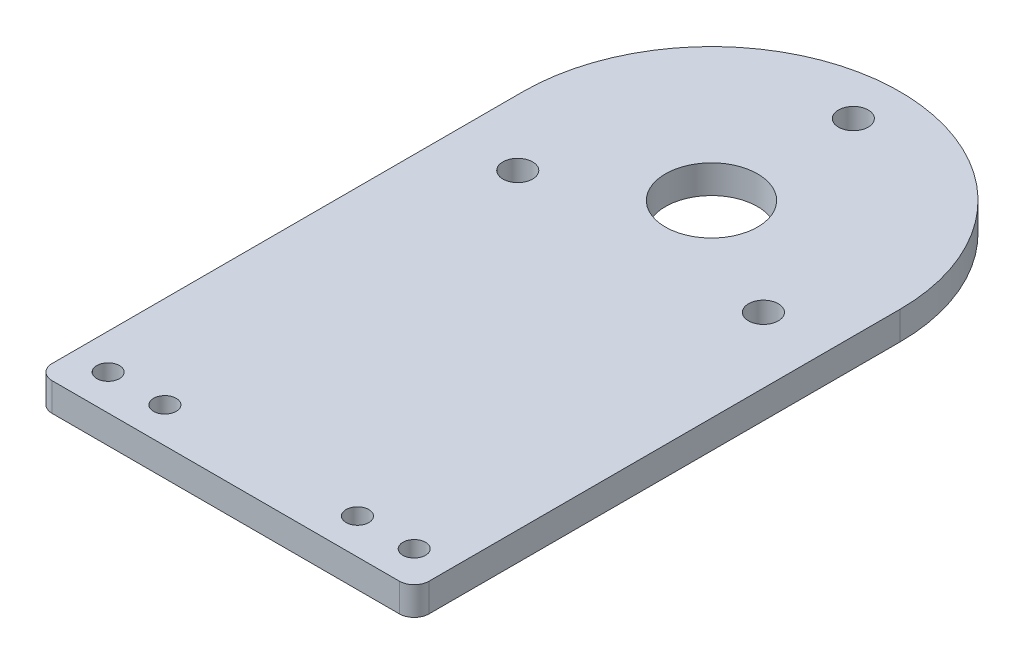
ISO-10303-21;
HEADER;
FILE_DESCRIPTION(('STEP AP214'),'2;1');
FILE_NAME('part.step','',(''),(''),'','','');
FILE_SCHEMA(('AUTOMOTIVE_DESIGN { 1 0 10303 214 1 1 1 1 }'));
ENDSEC;
DATA;
#1=APPLICATION_CONTEXT('core data for automotive mechanical design processes');
#2=APPLICATION_PROTOCOL_DEFINITION('international standard','automotive_design',2000,#1);
#3=PRODUCT_CONTEXT('',#1,'mechanical');
#4=PRODUCT('Part','Part','',(#3));
#5=PRODUCT_RELATED_PRODUCT_CATEGORY('part','',(#4));
#6=PRODUCT_DEFINITION_FORMATION('','',#4);
#7=PRODUCT_DEFINITION_CONTEXT('part definition',#1,'design');
#8=PRODUCT_DEFINITION('design','',#6,#7);
#9=PRODUCT_DEFINITION_SHAPE('','',#8);
#10=(LENGTH_UNIT() NAMED_UNIT(*) SI_UNIT(.MILLI.,.METRE.));
#11=(NAMED_UNIT(*) PLANE_ANGLE_UNIT() SI_UNIT($,.RADIAN.));
#12=(NAMED_UNIT(*) SI_UNIT($,.STERADIAN.) SOLID_ANGLE_UNIT());
#13=UNCERTAINTY_MEASURE_WITH_UNIT(LENGTH_MEASURE(1.E-05),#10,'distance_accuracy_value','');
#14=(GEOMETRIC_REPRESENTATION_CONTEXT(3) GLOBAL_UNCERTAINTY_ASSIGNED_CONTEXT((#13)) GLOBAL_UNIT_ASSIGNED_CONTEXT((#10,
#11,#12)) REPRESENTATION_CONTEXT('',''));
#15=CARTESIAN_POINT('',(0.,0.,0.));
#16=DIRECTION('',(0.,0.,1.));
#17=DIRECTION('',(1.,0.,0.));
#18=AXIS2_PLACEMENT_3D('',#15,#16,#17);
#19=CARTESIAN_POINT('',(24.4802958728512,4.,66.4044260639932));
#20=DIRECTION('',(0.,1.,0.));
#21=DIRECTION('',(0.,0.,1.));
#22=AXIS2_PLACEMENT_3D('',#19,#20,#21);
#23=PLANE('',#22);
#24=CARTESIAN_POINT('',(-13.5802958728512,4.,63.5044260639932));
#25=DIRECTION('',(0.,1.,0.));
#26=DIRECTION('',(0.,0.,-1.));
#27=AXIS2_PLACEMENT_3D('',#24,#25,#26);
#28=CIRCLE('',#27,1.6);
#29=CARTESIAN_POINT('',(-13.5802958728512,4.,61.9044260639932));
#30=VERTEX_POINT('',#29);
#31=EDGE_CURVE('E206',#30,#30,#28,.T.);
#32=ORIENTED_EDGE('',*,*,#31,.F.);
#33=EDGE_LOOP('',(#32));
#34=FACE_BOUND('',#33,.T.);
#35=CARTESIAN_POINT('',(21.5802958728512,4.,63.5044260639932));
#36=DIRECTION('',(0.,1.,0.));
#37=DIRECTION('',(0.,0.,1.));
#38=AXIS2_PLACEMENT_3D('',#35,#36,#37);
#39=CIRCLE('',#38,1.6);
#40=CARTESIAN_POINT('',(21.5802958728512,4.,65.1044260639932));
#41=VERTEX_POINT('',#40);
#42=EDGE_CURVE('E218',#41,#41,#39,.T.);
#43=ORIENTED_EDGE('',*,*,#42,.F.);
#44=EDGE_LOOP('',(#43));
#45=FACE_BOUND('',#44,.T.);
#46=CARTESIAN_POINT('',(-17.3205080756888,4.,9.9999999999999));
#47=DIRECTION('',(0.,1.,0.));
#48=DIRECTION('',(0.,0.,1.));
#49=AXIS2_PLACEMENT_3D('',#46,#47,#48);
#50=CIRCLE('',#49,2.1);
#51=CARTESIAN_POINT('',(-17.3205080756888,4.,12.0999999999999));
#52=VERTEX_POINT('',#51);
#53=EDGE_CURVE('E230',#52,#52,#50,.T.);
#54=ORIENTED_EDGE('',*,*,#53,.F.);
#55=EDGE_LOOP('',(#54));
#56=FACE_BOUND('',#55,.T.);
#57=CARTESIAN_POINT('',(0.,4.,0.));
#58=DIRECTION('',(0.,1.,0.));
#59=DIRECTION('',(0.,0.,1.));
#60=AXIS2_PLACEMENT_3D('',#57,#58,#59);
#61=CIRCLE('',#60,6.5);
#62=CARTESIAN_POINT('',(0.,4.,6.5));
#63=VERTEX_POINT('',#62);
#64=EDGE_CURVE('E123',#63,#63,#61,.T.);
#65=ORIENTED_EDGE('',*,*,#64,.F.);
#66=EDGE_LOOP('',(#65));
#67=FACE_BOUND('',#66,.T.);
#68=CARTESIAN_POINT('',(24.4802958728512,4.,66.4044260639932));
#69=DIRECTION('',(0.,1.,0.));
#70=DIRECTION('',(0.,0.,1.));
#71=AXIS2_PLACEMENT_3D('',#68,#69,#70);
#72=CIRCLE('',#71,2.10000000000001);
#73=CARTESIAN_POINT('',(24.4802958728512,4.,68.5044260639933));
#74=VERTEX_POINT('',#73);
#75=CARTESIAN_POINT('',(26.5802958728512,4.,66.4044260639932));
#76=VERTEX_POINT('',#75);
#77=EDGE_CURVE('E130',#74,#76,#72,.T.);
#78=ORIENTED_EDGE('',*,*,#77,.T.);
#79=DIRECTION('',(0.,0.,-1.));
#80=VECTOR('',#79,1.);
#81=CARTESIAN_POINT('',(26.5802958728512,4.,0.));
#82=LINE('',#81,#80);
#83=CARTESIAN_POINT('',(26.5802958728512,4.,0.));
#84=VERTEX_POINT('',#83);
#85=EDGE_CURVE('E88',#76,#84,#82,.T.);
#86=ORIENTED_EDGE('',*,*,#85,.T.);
#87=CARTESIAN_POINT('',(0.,4.,0.));
#88=DIRECTION('',(0.,1.,0.));
#89=DIRECTION('',(0.,0.,-1.));
#90=AXIS2_PLACEMENT_3D('',#87,#88,#89);
#91=CIRCLE('',#90,26.5802958728512);
#92=CARTESIAN_POINT('',(-26.5802958728512,4.,0.));
#93=VERTEX_POINT('',#92);
#94=EDGE_CURVE('E101',#84,#93,#91,.T.);
#95=ORIENTED_EDGE('',*,*,#94,.T.);
#96=DIRECTION('',(0.,0.,1.));
#97=VECTOR('',#96,1.);
#98=CARTESIAN_POINT('',(-26.5802958728512,4.,66.4044260639932));
#99=LINE('',#98,#97);
#100=CARTESIAN_POINT('',(-26.5802958728512,4.,66.4044260639932));
#101=VERTEX_POINT('',#100);
#102=EDGE_CURVE('E95',#93,#101,#99,.T.);
#103=ORIENTED_EDGE('',*,*,#102,.T.);
#104=CARTESIAN_POINT('',(-24.4802958728512,4.,66.4044260639932));
#105=DIRECTION('',(0.,1.,0.));
#106=DIRECTION('',(0.,0.,-1.));
#107=AXIS2_PLACEMENT_3D('',#104,#105,#106);
#108=CIRCLE('',#107,2.10000000000001);
#109=CARTESIAN_POINT('',(-24.4802958728512,4.,68.5044260639933));
#110=VERTEX_POINT('',#109);
#111=EDGE_CURVE('E99',#101,#110,#108,.T.);
#112=ORIENTED_EDGE('',*,*,#111,.T.);
#113=DIRECTION('',(1.,0.,0.));
#114=VECTOR('',#113,1.);
#115=CARTESIAN_POINT('',(-24.4802958728512,4.,68.5044260639933));
#116=LINE('',#115,#114);
#117=EDGE_CURVE('E51',#110,#74,#116,.T.);
#118=ORIENTED_EDGE('',*,*,#117,.T.);
#119=EDGE_LOOP('',(#78,#86,#95,#103,#112,#118));
#120=FACE_BOUND('',#119,.T.);
#121=CARTESIAN_POINT('',(0.,4.,-20.));
#122=DIRECTION('',(0.,1.,0.));
#123=DIRECTION('',(0.,0.,1.));
#124=AXIS2_PLACEMENT_3D('',#121,#122,#123);
#125=CIRCLE('',#124,2.1);
#126=CARTESIAN_POINT('',(0.,4.,-17.9));
#127=VERTEX_POINT('',#126);
#128=EDGE_CURVE('E236',#127,#127,#125,.T.);
#129=ORIENTED_EDGE('',*,*,#128,.F.);
#130=EDGE_LOOP('',(#129));
#131=FACE_BOUND('',#130,.T.);
#132=CARTESIAN_POINT('',(17.32050808,4.,9.9999999999999));
#133=DIRECTION('',(0.,1.,0.));
#134=DIRECTION('',(0.,0.,1.));
#135=AXIS2_PLACEMENT_3D('',#132,#133,#134);
#136=CIRCLE('',#135,2.1);
#137=CARTESIAN_POINT('',(17.32050808,4.,12.0999999999999));
#138=VERTEX_POINT('',#137);
#139=EDGE_CURVE('E224',#138,#138,#136,.T.);
#140=ORIENTED_EDGE('',*,*,#139,.F.);
#141=EDGE_LOOP('',(#140));
#142=FACE_BOUND('',#141,.T.);
#143=CARTESIAN_POINT('',(13.5802958728512,4.,63.5044260639932));
#144=DIRECTION('',(0.,1.,0.));
#145=DIRECTION('',(0.,0.,1.));
#146=AXIS2_PLACEMENT_3D('',#143,#144,#145);
#147=CIRCLE('',#146,1.6);
#148=CARTESIAN_POINT('',(13.5802958728512,4.,65.1044260639932));
#149=VERTEX_POINT('',#148);
#150=EDGE_CURVE('E212',#149,#149,#147,.T.);
#151=ORIENTED_EDGE('',*,*,#150,.F.);
#152=EDGE_LOOP('',(#151));
#153=FACE_BOUND('',#152,.T.);
#154=CARTESIAN_POINT('',(-21.5802958728512,4.,63.5044260639932));
#155=DIRECTION('',(0.,1.,0.));
#156=DIRECTION('',(0.,0.,-1.));
#157=AXIS2_PLACEMENT_3D('',#154,#155,#156);
#158=CIRCLE('',#157,1.6);
#159=CARTESIAN_POINT('',(-21.5802958728512,4.,61.9044260639932));
#160=VERTEX_POINT('',#159);
#161=EDGE_CURVE('E197',#160,#160,#158,.T.);
#162=ORIENTED_EDGE('',*,*,#161,.F.);
#163=EDGE_LOOP('',(#162));
#164=FACE_BOUND('',#163,.T.);
#165=ADVANCED_FACE('F34',(#34,#45,#56,#67,#120,#131,#142,#153,#164),#23,.T.);
#166=CARTESIAN_POINT('',(24.4802958728512,0.,66.4044260639932));
#167=DIRECTION('',(0.,1.,0.));
#168=DIRECTION('',(0.,0.,1.));
#169=AXIS2_PLACEMENT_3D('',#166,#167,#168);
#170=PLANE('',#169);
#171=CARTESIAN_POINT('',(24.4802958728512,0.,66.4044260639932));
#172=DIRECTION('',(0.,1.,0.));
#173=DIRECTION('',(0.,0.,1.));
#174=AXIS2_PLACEMENT_3D('',#171,#172,#173);
#175=CIRCLE('',#174,2.10000000000001);
#176=CARTESIAN_POINT('',(24.4802958728512,0.,68.5044260639933));
#177=VERTEX_POINT('',#176);
#178=CARTESIAN_POINT('',(26.5802958728512,0.,66.4044260639932));
#179=VERTEX_POINT('',#178);
#180=EDGE_CURVE('E119',#177,#179,#175,.T.);
#181=ORIENTED_EDGE('',*,*,#180,.F.);
#182=DIRECTION('',(1.,0.,0.));
#183=VECTOR('',#182,1.);
#184=CARTESIAN_POINT('',(-24.4802958728512,0.,68.5044260639933));
#185=LINE('',#184,#183);
#186=CARTESIAN_POINT('',(-24.4802958728512,0.,68.5044260639933));
#187=VERTEX_POINT('',#186);
#188=EDGE_CURVE('E80',#187,#177,#185,.T.);
#189=ORIENTED_EDGE('',*,*,#188,.F.);
#190=CARTESIAN_POINT('',(-24.4802958728512,0.,66.4044260639932));
#191=DIRECTION('',(0.,1.,0.));
#192=DIRECTION('',(0.,0.,-1.));
#193=AXIS2_PLACEMENT_3D('',#190,#191,#192);
#194=CIRCLE('',#193,2.10000000000001);
#195=CARTESIAN_POINT('',(-26.5802958728512,0.,66.4044260639932));
#196=VERTEX_POINT('',#195);
#197=EDGE_CURVE('E74',#196,#187,#194,.T.);
#198=ORIENTED_EDGE('',*,*,#197,.F.);
#199=DIRECTION('',(0.,0.,1.));
#200=VECTOR('',#199,1.);
#201=CARTESIAN_POINT('',(-26.5802958728512,0.,66.4044260639932));
#202=LINE('',#201,#200);
#203=CARTESIAN_POINT('',(-26.5802958728512,0.,0.));
#204=VERTEX_POINT('',#203);
#205=EDGE_CURVE('E109',#204,#196,#202,.T.);
#206=ORIENTED_EDGE('',*,*,#205,.F.);
#207=CARTESIAN_POINT('',(0.,0.,0.));
#208=DIRECTION('',(0.,1.,0.));
#209=DIRECTION('',(0.,0.,-1.));
#210=AXIS2_PLACEMENT_3D('',#207,#208,#209);
#211=CIRCLE('',#210,26.5802958728512);
#212=CARTESIAN_POINT('',(26.5802958728512,0.,0.));
#213=VERTEX_POINT('',#212);
#214=EDGE_CURVE('E125',#213,#204,#211,.T.);
#215=ORIENTED_EDGE('',*,*,#214,.F.);
#216=DIRECTION('',(0.,0.,-1.));
#217=VECTOR('',#216,1.);
#218=CARTESIAN_POINT('',(26.5802958728512,0.,0.));
#219=LINE('',#218,#217);
#220=EDGE_CURVE('E122',#179,#213,#219,.T.);
#221=ORIENTED_EDGE('',*,*,#220,.F.);
#222=EDGE_LOOP('',(#181,#189,#198,#206,#215,#221));
#223=FACE_BOUND('',#222,.T.);
#224=CARTESIAN_POINT('',(0.,0.,0.));
#225=DIRECTION('',(0.,1.,0.));
#226=DIRECTION('',(0.,0.,1.));
#227=AXIS2_PLACEMENT_3D('',#224,#225,#226);
#228=CIRCLE('',#227,6.5);
#229=CARTESIAN_POINT('',(0.,0.,6.5));
#230=VERTEX_POINT('',#229);
#231=EDGE_CURVE('E239',#230,#230,#228,.T.);
#232=ORIENTED_EDGE('',*,*,#231,.T.);
#233=EDGE_LOOP('',(#232));
#234=FACE_BOUND('',#233,.T.);
#235=CARTESIAN_POINT('',(0.,0.,-20.));
#236=DIRECTION('',(0.,1.,0.));
#237=DIRECTION('',(0.,0.,1.));
#238=AXIS2_PLACEMENT_3D('',#235,#236,#237);
#239=CIRCLE('',#238,2.1);
#240=CARTESIAN_POINT('',(0.,0.,-17.9));
#241=VERTEX_POINT('',#240);
#242=EDGE_CURVE('E233',#241,#241,#239,.T.);
#243=ORIENTED_EDGE('',*,*,#242,.T.);
#244=EDGE_LOOP('',(#243));
#245=FACE_BOUND('',#244,.T.);
#246=CARTESIAN_POINT('',(-17.3205080756888,0.,9.9999999999999));
#247=DIRECTION('',(0.,1.,0.));
#248=DIRECTION('',(0.,0.,1.));
#249=AXIS2_PLACEMENT_3D('',#246,#247,#248);
#250=CIRCLE('',#249,2.1);
#251=CARTESIAN_POINT('',(-17.3205080756888,0.,12.0999999999999));
#252=VERTEX_POINT('',#251);
#253=EDGE_CURVE('E227',#252,#252,#250,.T.);
#254=ORIENTED_EDGE('',*,*,#253,.T.);
#255=EDGE_LOOP('',(#254));
#256=FACE_BOUND('',#255,.T.);
#257=CARTESIAN_POINT('',(17.32050808,0.,9.9999999999999));
#258=DIRECTION('',(0.,1.,0.));
#259=DIRECTION('',(0.,0.,1.));
#260=AXIS2_PLACEMENT_3D('',#257,#258,#259);
#261=CIRCLE('',#260,2.1);
#262=CARTESIAN_POINT('',(17.32050808,0.,12.0999999999999));
#263=VERTEX_POINT('',#262);
#264=EDGE_CURVE('E221',#263,#263,#261,.T.);
#265=ORIENTED_EDGE('',*,*,#264,.T.);
#266=EDGE_LOOP('',(#265));
#267=FACE_BOUND('',#266,.T.);
#268=CARTESIAN_POINT('',(21.5802958728512,0.,63.5044260639932));
#269=DIRECTION('',(0.,1.,0.));
#270=DIRECTION('',(0.,0.,1.));
#271=AXIS2_PLACEMENT_3D('',#268,#269,#270);
#272=CIRCLE('',#271,1.6);
#273=CARTESIAN_POINT('',(21.5802958728512,0.,65.1044260639932));
#274=VERTEX_POINT('',#273);
#275=EDGE_CURVE('E215',#274,#274,#272,.T.);
#276=ORIENTED_EDGE('',*,*,#275,.T.);
#277=EDGE_LOOP('',(#276));
#278=FACE_BOUND('',#277,.T.);
#279=CARTESIAN_POINT('',(13.5802958728512,0.,63.5044260639932));
#280=DIRECTION('',(0.,1.,0.));
#281=DIRECTION('',(0.,0.,1.));
#282=AXIS2_PLACEMENT_3D('',#279,#280,#281);
#283=CIRCLE('',#282,1.6);
#284=CARTESIAN_POINT('',(13.5802958728512,0.,65.1044260639932));
#285=VERTEX_POINT('',#284);
#286=EDGE_CURVE('E209',#285,#285,#283,.T.);
#287=ORIENTED_EDGE('',*,*,#286,.T.);
#288=EDGE_LOOP('',(#287));
#289=FACE_BOUND('',#288,.T.);
#290=CARTESIAN_POINT('',(-13.5802958728512,0.,63.5044260639932));
#291=DIRECTION('',(0.,1.,0.));
#292=DIRECTION('',(0.,0.,-1.));
#293=AXIS2_PLACEMENT_3D('',#290,#291,#292);
#294=CIRCLE('',#293,1.6);
#295=CARTESIAN_POINT('',(-13.5802958728512,0.,61.9044260639932));
#296=VERTEX_POINT('',#295);
#297=EDGE_CURVE('E203',#296,#296,#294,.T.);
#298=ORIENTED_EDGE('',*,*,#297,.T.);
#299=EDGE_LOOP('',(#298));
#300=FACE_BOUND('',#299,.T.);
#301=CARTESIAN_POINT('',(-21.5802958728512,0.,63.5044260639932));
#302=DIRECTION('',(0.,1.,0.));
#303=DIRECTION('',(0.,0.,-1.));
#304=AXIS2_PLACEMENT_3D('',#301,#302,#303);
#305=CIRCLE('',#304,1.6);
#306=CARTESIAN_POINT('',(-21.5802958728512,0.,61.9044260639932));
#307=VERTEX_POINT('',#306);
#308=EDGE_CURVE('E200',#307,#307,#305,.T.);
#309=ORIENTED_EDGE('',*,*,#308,.T.);
#310=EDGE_LOOP('',(#309));
#311=FACE_BOUND('',#310,.T.);
#312=ADVANCED_FACE('F139',(#223,#234,#245,#256,#267,#278,#289,#300,#311),#170,.F.);
#313=CARTESIAN_POINT('',(24.4802958728512,4.,66.4044260639932));
#314=DIRECTION('',(0.,-1.,0.));
#315=DIRECTION('',(0.,0.,-1.));
#316=AXIS2_PLACEMENT_3D('',#313,#314,#315);
#317=CYLINDRICAL_SURFACE('',#316,2.10000000000001);
#318=ORIENTED_EDGE('',*,*,#180,.T.);
#319=DIRECTION('',(0.,-1.,0.));
#320=VECTOR('',#319,1.);
#321=CARTESIAN_POINT('',(26.5802958728512,4.,66.4044260639932));
#322=LINE('',#321,#320);
#323=EDGE_CURVE('E11',#76,#179,#322,.T.);
#324=ORIENTED_EDGE('',*,*,#323,.F.);
#325=ORIENTED_EDGE('',*,*,#77,.F.);
#326=DIRECTION('',(0.,-1.,0.));
#327=VECTOR('',#326,1.);
#328=CARTESIAN_POINT('',(24.4802958728512,4.,68.5044260639933));
#329=LINE('',#328,#327);
#330=EDGE_CURVE('E115',#74,#177,#329,.T.);
#331=ORIENTED_EDGE('',*,*,#330,.T.);
#332=EDGE_LOOP('',(#318,#324,#325,#331));
#333=FACE_BOUND('',#332,.T.);
#334=ADVANCED_FACE('F36',(#333),#317,.T.);
#335=CARTESIAN_POINT('',(26.5802958728512,4.,0.));
#336=DIRECTION('',(-1.,0.,0.));
#337=DIRECTION('',(0.,0.,1.));
#338=AXIS2_PLACEMENT_3D('',#335,#336,#337);
#339=PLANE('',#338);
#340=ORIENTED_EDGE('',*,*,#220,.T.);
#341=DIRECTION('',(0.,-1.,0.));
#342=VECTOR('',#341,1.);
#343=CARTESIAN_POINT('',(26.5802958728512,4.,0.));
#344=LINE('',#343,#342);
#345=EDGE_CURVE('E43',#84,#213,#344,.T.);
#346=ORIENTED_EDGE('',*,*,#345,.F.);
#347=ORIENTED_EDGE('',*,*,#85,.F.);
#348=ORIENTED_EDGE('',*,*,#323,.T.);
#349=EDGE_LOOP('',(#340,#346,#347,#348));
#350=FACE_BOUND('',#349,.T.);
#351=ADVANCED_FACE('F333',(#350),#339,.F.);
#352=CARTESIAN_POINT('',(0.,4.,0.));
#353=DIRECTION('',(0.,-1.,0.));
#354=DIRECTION('',(0.,0.,-1.));
#355=AXIS2_PLACEMENT_3D('',#352,#353,#354);
#356=CYLINDRICAL_SURFACE('',#355,26.5802958728512);
#357=ORIENTED_EDGE('',*,*,#214,.T.);
#358=DIRECTION('',(0.,-1.,0.));
#359=VECTOR('',#358,1.);
#360=CARTESIAN_POINT('',(-26.5802958728512,4.,0.));
#361=LINE('',#360,#359);
#362=EDGE_CURVE('E110',#93,#204,#361,.T.);
#363=ORIENTED_EDGE('',*,*,#362,.F.);
#364=ORIENTED_EDGE('',*,*,#94,.F.);
#365=ORIENTED_EDGE('',*,*,#345,.T.);
#366=EDGE_LOOP('',(#357,#363,#364,#365));
#367=FACE_BOUND('',#366,.T.);
#368=ADVANCED_FACE('F136',(#367),#356,.T.);
#369=CARTESIAN_POINT('',(-26.5802958728512,4.,66.4044260639932));
#370=DIRECTION('',(1.,0.,0.));
#371=DIRECTION('',(0.,0.,-1.));
#372=AXIS2_PLACEMENT_3D('',#369,#370,#371);
#373=PLANE('',#372);
#374=ORIENTED_EDGE('',*,*,#205,.T.);
#375=DIRECTION('',(0.,-1.,0.));
#376=VECTOR('',#375,1.);
#377=CARTESIAN_POINT('',(-26.5802958728512,4.,66.4044260639932));
#378=LINE('',#377,#376);
#379=EDGE_CURVE('E106',#101,#196,#378,.T.);
#380=ORIENTED_EDGE('',*,*,#379,.F.);
#381=ORIENTED_EDGE('',*,*,#102,.F.);
#382=ORIENTED_EDGE('',*,*,#362,.T.);
#383=EDGE_LOOP('',(#374,#380,#381,#382));
#384=FACE_BOUND('',#383,.T.);
#385=ADVANCED_FACE('F107',(#384),#373,.F.);
#386=CARTESIAN_POINT('',(-24.4802958728512,4.,66.4044260639932));
#387=DIRECTION('',(0.,-1.,0.));
#388=DIRECTION('',(0.,0.,-1.));
#389=AXIS2_PLACEMENT_3D('',#386,#387,#388);
#390=CYLINDRICAL_SURFACE('',#389,2.10000000000001);
#391=ORIENTED_EDGE('',*,*,#197,.T.);
#392=DIRECTION('',(0.,-1.,0.));
#393=VECTOR('',#392,1.);
#394=CARTESIAN_POINT('',(-24.4802958728512,4.,68.5044260639933));
#395=LINE('',#394,#393);
#396=EDGE_CURVE('E111',#110,#187,#395,.T.);
#397=ORIENTED_EDGE('',*,*,#396,.F.);
#398=ORIENTED_EDGE('',*,*,#111,.F.);
#399=ORIENTED_EDGE('',*,*,#379,.T.);
#400=EDGE_LOOP('',(#391,#397,#398,#399));
#401=FACE_BOUND('',#400,.T.);
#402=ADVANCED_FACE('F113',(#401),#390,.T.);
#403=CARTESIAN_POINT('',(-24.4802958728512,4.,68.5044260639933));
#404=DIRECTION('',(0.,0.,-1.));
#405=DIRECTION('',(-1.,0.,0.));
#406=AXIS2_PLACEMENT_3D('',#403,#404,#405);
#407=PLANE('',#406);
#408=ORIENTED_EDGE('',*,*,#188,.T.);
#409=ORIENTED_EDGE('',*,*,#330,.F.);
#410=ORIENTED_EDGE('',*,*,#117,.F.);
#411=ORIENTED_EDGE('',*,*,#396,.T.);
#412=EDGE_LOOP('',(#408,#409,#410,#411));
#413=FACE_BOUND('',#412,.T.);
#414=ADVANCED_FACE('F144',(#413),#407,.F.);
#415=CARTESIAN_POINT('',(0.,4.,0.));
#416=DIRECTION('',(0.,-1.,0.));
#417=DIRECTION('',(0.,0.,-1.));
#418=AXIS2_PLACEMENT_3D('',#415,#416,#417);
#419=CYLINDRICAL_SURFACE('',#418,6.5);
#420=ORIENTED_EDGE('',*,*,#64,.T.);
#421=EDGE_LOOP('',(#420));
#422=FACE_BOUND('',#421,.T.);
#423=ORIENTED_EDGE('',*,*,#231,.F.);
#424=EDGE_LOOP('',(#423));
#425=FACE_BOUND('',#424,.T.);
#426=ADVANCED_FACE('F146',(#422,#425),#419,.F.);
#427=CARTESIAN_POINT('',(0.,4.,-20.));
#428=DIRECTION('',(0.,-1.,0.));
#429=DIRECTION('',(0.,0.,-1.));
#430=AXIS2_PLACEMENT_3D('',#427,#428,#429);
#431=CYLINDRICAL_SURFACE('',#430,2.1);
#432=ORIENTED_EDGE('',*,*,#128,.T.);
#433=EDGE_LOOP('',(#432));
#434=FACE_BOUND('',#433,.T.);
#435=ORIENTED_EDGE('',*,*,#242,.F.);
#436=EDGE_LOOP('',(#435));
#437=FACE_BOUND('',#436,.T.);
#438=ADVANCED_FACE('F152',(#434,#437),#431,.F.);
#439=CARTESIAN_POINT('',(-17.3205080756888,4.,9.9999999999999));
#440=DIRECTION('',(0.,-1.,0.));
#441=DIRECTION('',(0.,0.,-1.));
#442=AXIS2_PLACEMENT_3D('',#439,#440,#441);
#443=CYLINDRICAL_SURFACE('',#442,2.1);
#444=ORIENTED_EDGE('',*,*,#53,.T.);
#445=EDGE_LOOP('',(#444));
#446=FACE_BOUND('',#445,.T.);
#447=ORIENTED_EDGE('',*,*,#253,.F.);
#448=EDGE_LOOP('',(#447));
#449=FACE_BOUND('',#448,.T.);
#450=ADVANCED_FACE('F168',(#446,#449),#443,.F.);
#451=CARTESIAN_POINT('',(17.32050808,4.,9.9999999999999));
#452=DIRECTION('',(0.,-1.,0.));
#453=DIRECTION('',(0.,0.,-1.));
#454=AXIS2_PLACEMENT_3D('',#451,#452,#453);
#455=CYLINDRICAL_SURFACE('',#454,2.1);
#456=ORIENTED_EDGE('',*,*,#139,.T.);
#457=EDGE_LOOP('',(#456));
#458=FACE_BOUND('',#457,.T.);
#459=ORIENTED_EDGE('',*,*,#264,.F.);
#460=EDGE_LOOP('',(#459));
#461=FACE_BOUND('',#460,.T.);
#462=ADVANCED_FACE('F172',(#458,#461),#455,.F.);
#463=CARTESIAN_POINT('',(21.5802958728512,4.,63.5044260639932));
#464=DIRECTION('',(0.,-1.,0.));
#465=DIRECTION('',(0.,0.,-1.));
#466=AXIS2_PLACEMENT_3D('',#463,#464,#465);
#467=CYLINDRICAL_SURFACE('',#466,1.6);
#468=ORIENTED_EDGE('',*,*,#42,.T.);
#469=EDGE_LOOP('',(#468));
#470=FACE_BOUND('',#469,.T.);
#471=ORIENTED_EDGE('',*,*,#275,.F.);
#472=EDGE_LOOP('',(#471));
#473=FACE_BOUND('',#472,.T.);
#474=ADVANCED_FACE('F176',(#470,#473),#467,.F.);
#475=CARTESIAN_POINT('',(13.5802958728512,4.,63.5044260639932));
#476=DIRECTION('',(0.,-1.,0.));
#477=DIRECTION('',(0.,0.,-1.));
#478=AXIS2_PLACEMENT_3D('',#475,#476,#477);
#479=CYLINDRICAL_SURFACE('',#478,1.6);
#480=ORIENTED_EDGE('',*,*,#150,.T.);
#481=EDGE_LOOP('',(#480));
#482=FACE_BOUND('',#481,.T.);
#483=ORIENTED_EDGE('',*,*,#286,.F.);
#484=EDGE_LOOP('',(#483));
#485=FACE_BOUND('',#484,.T.);
#486=ADVANCED_FACE('F180',(#482,#485),#479,.F.);
#487=CARTESIAN_POINT('',(-13.5802958728512,4.,63.5044260639932));
#488=DIRECTION('',(0.,-1.,0.));
#489=DIRECTION('',(0.,0.,-1.));
#490=AXIS2_PLACEMENT_3D('',#487,#488,#489);
#491=CYLINDRICAL_SURFACE('',#490,1.6);
#492=ORIENTED_EDGE('',*,*,#31,.T.);
#493=EDGE_LOOP('',(#492));
#494=FACE_BOUND('',#493,.T.);
#495=ORIENTED_EDGE('',*,*,#297,.F.);
#496=EDGE_LOOP('',(#495));
#497=FACE_BOUND('',#496,.T.);
#498=ADVANCED_FACE('F184',(#494,#497),#491,.F.);
#499=CARTESIAN_POINT('',(-21.5802958728512,4.,63.5044260639932));
#500=DIRECTION('',(0.,-1.,0.));
#501=DIRECTION('',(0.,0.,-1.));
#502=AXIS2_PLACEMENT_3D('',#499,#500,#501);
#503=CYLINDRICAL_SURFACE('',#502,1.6);
#504=ORIENTED_EDGE('',*,*,#161,.T.);
#505=EDGE_LOOP('',(#504));
#506=FACE_BOUND('',#505,.T.);
#507=ORIENTED_EDGE('',*,*,#308,.F.);
#508=EDGE_LOOP('',(#507));
#509=FACE_BOUND('',#508,.T.);
#510=ADVANCED_FACE('F188',(#506,#509),#503,.F.);
#511=CLOSED_SHELL('',(#165,#312,#334,#351,#368,#385,#402,#414,#426,#438,#450,#462,#474,#486,
#498,#510));
#512=MANIFOLD_SOLID_BREP('B2',#511);
#513=ADVANCED_BREP_SHAPE_REPRESENTATION('',(#18,#512),#14);
#514=SHAPE_DEFINITION_REPRESENTATION(#9,#513);
ENDSEC;
END-ISO-10303-21;
